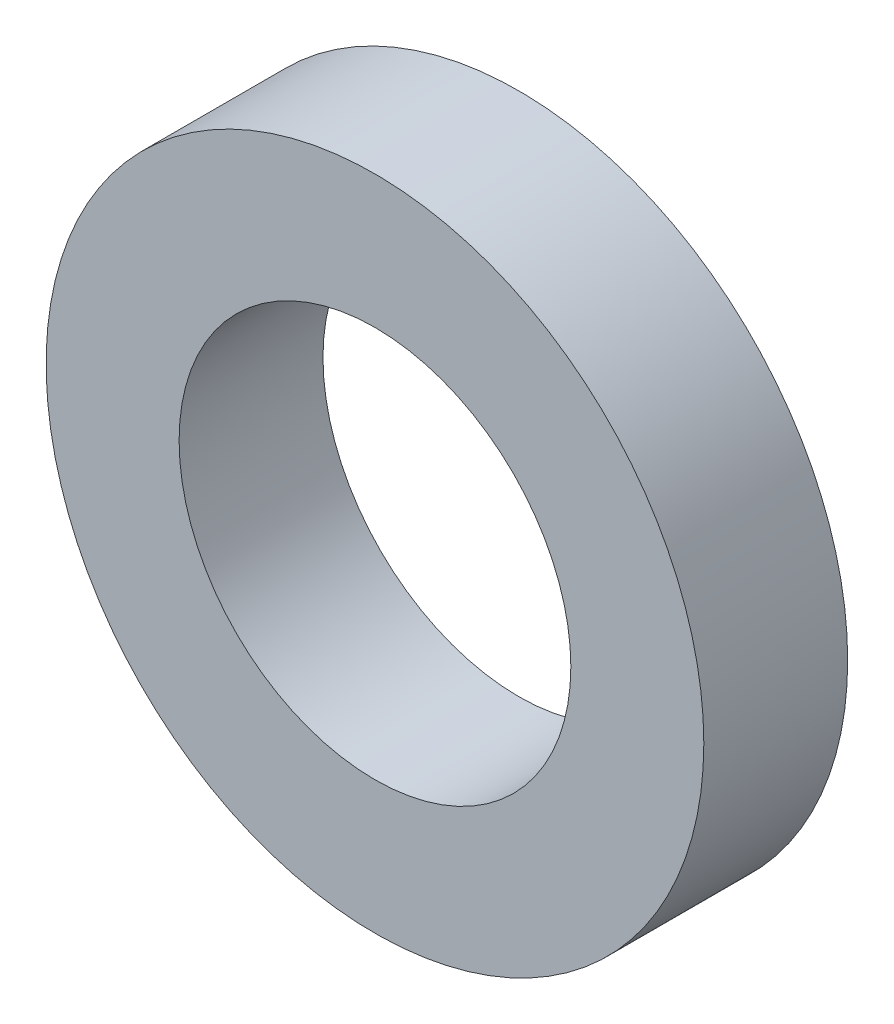
ISO-10303-21;
HEADER;
FILE_DESCRIPTION(('STEP AP214'),'2;1');
FILE_NAME('part.step','',(''),(''),'','','');
FILE_SCHEMA(('AUTOMOTIVE_DESIGN { 1 0 10303 214 1 1 1 1 }'));
ENDSEC;
DATA;
#1=APPLICATION_CONTEXT('core data for automotive mechanical design processes');
#2=APPLICATION_PROTOCOL_DEFINITION('international standard','automotive_design',2000,#1);
#3=PRODUCT_CONTEXT('',#1,'mechanical');
#4=PRODUCT('Part','Part','',(#3));
#5=PRODUCT_RELATED_PRODUCT_CATEGORY('part','',(#4));
#6=PRODUCT_DEFINITION_FORMATION('','',#4);
#7=PRODUCT_DEFINITION_CONTEXT('part definition',#1,'design');
#8=PRODUCT_DEFINITION('design','',#6,#7);
#9=PRODUCT_DEFINITION_SHAPE('','',#8);
#10=(LENGTH_UNIT() NAMED_UNIT(*) SI_UNIT(.MILLI.,.METRE.));
#11=(NAMED_UNIT(*) PLANE_ANGLE_UNIT() SI_UNIT($,.RADIAN.));
#12=(NAMED_UNIT(*) SI_UNIT($,.STERADIAN.) SOLID_ANGLE_UNIT());
#13=UNCERTAINTY_MEASURE_WITH_UNIT(LENGTH_MEASURE(1.E-05),#10,'distance_accuracy_value','');
#14=(GEOMETRIC_REPRESENTATION_CONTEXT(3) GLOBAL_UNCERTAINTY_ASSIGNED_CONTEXT((#13)) GLOBAL_UNIT_ASSIGNED_CONTEXT((#10,
#11,#12)) REPRESENTATION_CONTEXT('',''));
#15=CARTESIAN_POINT('',(0.,0.,0.));
#16=DIRECTION('',(0.,0.,1.));
#17=DIRECTION('',(1.,0.,0.));
#18=AXIS2_PLACEMENT_3D('',#15,#16,#17);
#19=CARTESIAN_POINT('',(0.,0.,7.));
#20=DIRECTION('',(0.,0.,1.));
#21=DIRECTION('',(1.,0.,0.));
#22=AXIS2_PLACEMENT_3D('',#19,#20,#21);
#23=PLANE('',#22);
#24=CARTESIAN_POINT('',(0.,0.,7.));
#25=DIRECTION('',(0.,0.,1.));
#26=DIRECTION('',(1.,0.,0.));
#27=AXIS2_PLACEMENT_3D('',#24,#25,#26);
#28=CIRCLE('',#27,16.);
#29=CARTESIAN_POINT('',(16.,0.,7.));
#30=VERTEX_POINT('',#29);
#31=EDGE_CURVE('E10',#30,#30,#28,.T.);
#32=ORIENTED_EDGE('',*,*,#31,.T.);
#33=EDGE_LOOP('',(#32));
#34=FACE_BOUND('',#33,.T.);
#35=CARTESIAN_POINT('',(0.,0.,7.));
#36=DIRECTION('',(0.,0.,1.));
#37=DIRECTION('',(1.,0.,0.));
#38=AXIS2_PLACEMENT_3D('',#35,#36,#37);
#39=CIRCLE('',#38,9.53);
#40=CARTESIAN_POINT('',(9.53,0.,7.));
#41=VERTEX_POINT('',#40);
#42=EDGE_CURVE('E48',#41,#41,#39,.T.);
#43=ORIENTED_EDGE('',*,*,#42,.F.);
#44=EDGE_LOOP('',(#43));
#45=FACE_BOUND('',#44,.T.);
#46=ADVANCED_FACE('F37',(#34,#45),#23,.T.);
#47=CARTESIAN_POINT('',(0.,0.,0.));
#48=DIRECTION('',(0.,0.,1.));
#49=DIRECTION('',(1.,0.,0.));
#50=AXIS2_PLACEMENT_3D('',#47,#48,#49);
#51=PLANE('',#50);
#52=CARTESIAN_POINT('',(0.,0.,0.));
#53=DIRECTION('',(0.,0.,1.));
#54=DIRECTION('',(1.,0.,0.));
#55=AXIS2_PLACEMENT_3D('',#52,#53,#54);
#56=CIRCLE('',#55,16.);
#57=CARTESIAN_POINT('',(16.,0.,0.));
#58=VERTEX_POINT('',#57);
#59=EDGE_CURVE('E41',#58,#58,#56,.T.);
#60=ORIENTED_EDGE('',*,*,#59,.F.);
#61=EDGE_LOOP('',(#60));
#62=FACE_BOUND('',#61,.T.);
#63=CARTESIAN_POINT('',(0.,0.,0.));
#64=DIRECTION('',(0.,0.,1.));
#65=DIRECTION('',(1.,0.,0.));
#66=AXIS2_PLACEMENT_3D('',#63,#64,#65);
#67=CIRCLE('',#66,9.53);
#68=CARTESIAN_POINT('',(9.53,0.,0.));
#69=VERTEX_POINT('',#68);
#70=EDGE_CURVE('E50',#69,#69,#67,.T.);
#71=ORIENTED_EDGE('',*,*,#70,.T.);
#72=EDGE_LOOP('',(#71));
#73=FACE_BOUND('',#72,.T.);
#74=ADVANCED_FACE('F60',(#62,#73),#51,.F.);
#75=CARTESIAN_POINT('',(0.,0.,7.));
#76=DIRECTION('',(0.,0.,-1.));
#77=DIRECTION('',(-1.,0.,0.));
#78=AXIS2_PLACEMENT_3D('',#75,#76,#77);
#79=CYLINDRICAL_SURFACE('',#78,16.);
#80=ORIENTED_EDGE('',*,*,#31,.F.);
#81=EDGE_LOOP('',(#80));
#82=FACE_BOUND('',#81,.T.);
#83=ORIENTED_EDGE('',*,*,#59,.T.);
#84=EDGE_LOOP('',(#83));
#85=FACE_BOUND('',#84,.T.);
#86=ADVANCED_FACE('F39',(#82,#85),#79,.T.);
#87=CARTESIAN_POINT('',(0.,0.,7.));
#88=DIRECTION('',(0.,0.,-1.));
#89=DIRECTION('',(-1.,0.,0.));
#90=AXIS2_PLACEMENT_3D('',#87,#88,#89);
#91=CYLINDRICAL_SURFACE('',#90,9.53);
#92=ORIENTED_EDGE('',*,*,#42,.T.);
#93=EDGE_LOOP('',(#92));
#94=FACE_BOUND('',#93,.T.);
#95=ORIENTED_EDGE('',*,*,#70,.F.);
#96=EDGE_LOOP('',(#95));
#97=FACE_BOUND('',#96,.T.);
#98=ADVANCED_FACE('F56',(#94,#97),#91,.F.);
#99=CLOSED_SHELL('',(#46,#74,#86,#98));
#100=MANIFOLD_SOLID_BREP('B2',#99);
#101=ADVANCED_BREP_SHAPE_REPRESENTATION('',(#18,#100),#14);
#102=SHAPE_DEFINITION_REPRESENTATION(#9,#101);
ENDSEC;
END-ISO-10303-21;
